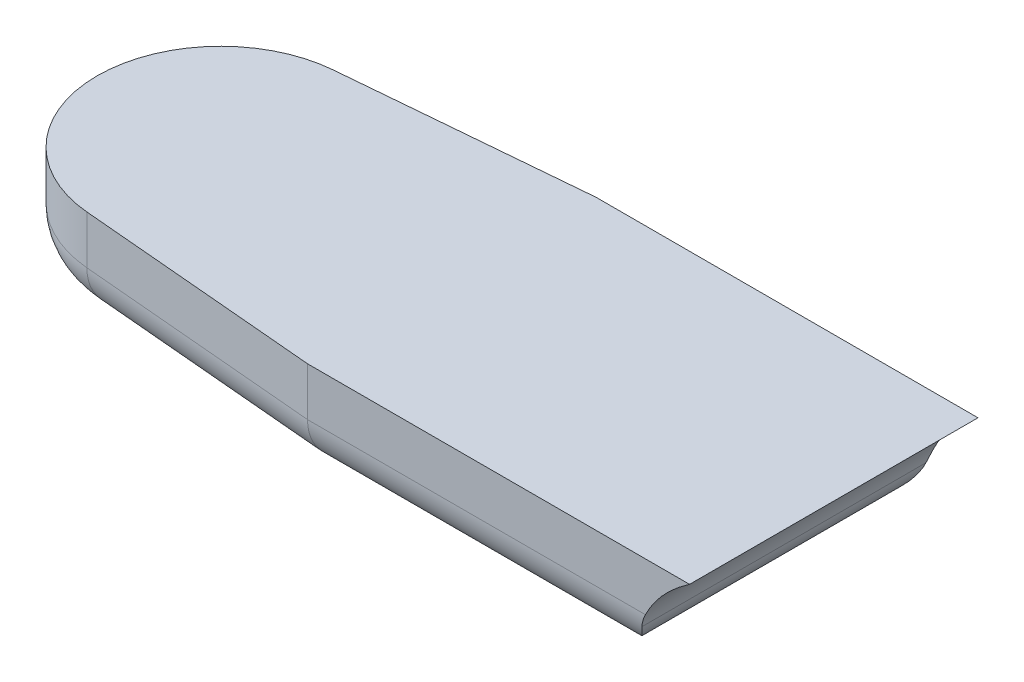
ISO-10303-21;
HEADER;
FILE_DESCRIPTION(('STEP AP214'),'2;1');
FILE_NAME('part.step','',(''),(''),'','','');
FILE_SCHEMA(('AUTOMOTIVE_DESIGN { 1 0 10303 214 1 1 1 1 }'));
ENDSEC;
DATA;
#1=APPLICATION_CONTEXT('core data for automotive mechanical design processes');
#2=APPLICATION_PROTOCOL_DEFINITION('international standard','automotive_design',2000,#1);
#3=PRODUCT_CONTEXT('',#1,'mechanical');
#4=PRODUCT('Part','Part','',(#3));
#5=PRODUCT_RELATED_PRODUCT_CATEGORY('part','',(#4));
#6=PRODUCT_DEFINITION_FORMATION('','',#4);
#7=PRODUCT_DEFINITION_CONTEXT('part definition',#1,'design');
#8=PRODUCT_DEFINITION('design','',#6,#7);
#9=PRODUCT_DEFINITION_SHAPE('','',#8);
#10=(LENGTH_UNIT() NAMED_UNIT(*) SI_UNIT(.MILLI.,.METRE.));
#11=(NAMED_UNIT(*) PLANE_ANGLE_UNIT() SI_UNIT($,.RADIAN.));
#12=(NAMED_UNIT(*) SI_UNIT($,.STERADIAN.) SOLID_ANGLE_UNIT());
#13=UNCERTAINTY_MEASURE_WITH_UNIT(LENGTH_MEASURE(1.E-05),#10,'distance_accuracy_value','');
#14=(GEOMETRIC_REPRESENTATION_CONTEXT(3) GLOBAL_UNCERTAINTY_ASSIGNED_CONTEXT((#13)) GLOBAL_UNIT_ASSIGNED_CONTEXT((#10,
#11,#12)) REPRESENTATION_CONTEXT('',''));
#15=CARTESIAN_POINT('',(0.,0.,0.));
#16=DIRECTION('',(0.,0.,1.));
#17=DIRECTION('',(1.,0.,0.));
#18=AXIS2_PLACEMENT_3D('',#15,#16,#17);
#19=CARTESIAN_POINT('',(32.8063610503625,-20.,0.));
#20=DIRECTION('',(0.,1.,0.));
#21=DIRECTION('',(0.,0.,1.));
#22=AXIS2_PLACEMENT_3D('',#19,#20,#21);
#23=CYLINDRICAL_SURFACE('',#22,25.5478591046329);
#24=DIRECTION('',(0.,1.,0.));
#25=VECTOR('',#24,1.);
#26=CARTESIAN_POINT('',(30.5797184144859,-20.,-25.4506417876303));
#27=LINE('',#26,#25);
#28=CARTESIAN_POINT('',(30.5797184144859,-10.,-25.4506417876303));
#29=VERTEX_POINT('',#28);
#30=CARTESIAN_POINT('',(30.5797184144859,0.,-25.4506417876303));
#31=VERTEX_POINT('',#30);
#32=EDGE_CURVE('E152',#29,#31,#27,.T.);
#33=ORIENTED_EDGE('',*,*,#32,.F.);
#34=CARTESIAN_POINT('',(32.8063610503625,-10.,0.));
#35=DIRECTION('',(0.,-1.,0.));
#36=DIRECTION('',(0.,0.,-1.));
#37=AXIS2_PLACEMENT_3D('',#34,#35,#36);
#38=CIRCLE('',#37,25.5478591046329);
#39=CARTESIAN_POINT('',(30.579718414486,-10.,25.4506417876303));
#40=VERTEX_POINT('',#39);
#41=EDGE_CURVE('E172',#29,#40,#38,.F.);
#42=ORIENTED_EDGE('',*,*,#41,.T.);
#43=DIRECTION('',(0.,1.,0.));
#44=VECTOR('',#43,1.);
#45=CARTESIAN_POINT('',(30.579718414486,-20.,25.4506417876303));
#46=LINE('',#45,#44);
#47=CARTESIAN_POINT('',(30.579718414486,0.,25.4506417876303));
#48=VERTEX_POINT('',#47);
#49=EDGE_CURVE('E141',#40,#48,#46,.T.);
#50=ORIENTED_EDGE('',*,*,#49,.T.);
#51=CARTESIAN_POINT('',(32.8063610503625,0.,0.));
#52=DIRECTION('',(0.,-1.,0.));
#53=DIRECTION('',(0.,0.,-1.));
#54=AXIS2_PLACEMENT_3D('',#51,#52,#53);
#55=CIRCLE('',#54,25.5478591046329);
#56=EDGE_CURVE('E125',#48,#31,#55,.T.);
#57=ORIENTED_EDGE('',*,*,#56,.T.);
#58=EDGE_LOOP('',(#33,#42,#50,#57));
#59=FACE_BOUND('',#58,.T.);
#60=ADVANCED_FACE('F39',(#59),#23,.T.);
#61=CARTESIAN_POINT('',(30.5797184144859,-20.,-25.4506417876303));
#62=DIRECTION('',(0.0871557427476479,0.,0.996194698091746));
#63=DIRECTION('',(0.996194698091746,0.,-0.0871557427476479));
#64=AXIS2_PLACEMENT_3D('',#61,#62,#63);
#65=PLANE('',#64);
#66=DIRECTION('',(0.,1.,0.));
#67=VECTOR('',#66,1.);
#68=CARTESIAN_POINT('',(80.579718414486,-20.,-29.8250749639259));
#69=LINE('',#68,#67);
#70=CARTESIAN_POINT('',(80.579718414486,-10.,-29.8250749639259));
#71=VERTEX_POINT('',#70);
#72=CARTESIAN_POINT('',(80.579718414486,0.,-29.8250749639259));
#73=VERTEX_POINT('',#72);
#74=EDGE_CURVE('E150',#71,#73,#69,.T.);
#75=ORIENTED_EDGE('',*,*,#74,.F.);
#76=DIRECTION('',(0.996194698091746,0.,-0.0871557427476479));
#77=VECTOR('',#76,1.);
#78=CARTESIAN_POINT('',(30.5797184144859,-10.,-25.4506417876303));
#79=LINE('',#78,#77);
#80=EDGE_CURVE('E170',#71,#29,#79,.F.);
#81=ORIENTED_EDGE('',*,*,#80,.T.);
#82=ORIENTED_EDGE('',*,*,#32,.T.);
#83=DIRECTION('',(0.996194698091746,0.,-0.0871557427476479));
#84=VECTOR('',#83,1.);
#85=CARTESIAN_POINT('',(30.5797184144859,0.,-25.4506417876303));
#86=LINE('',#85,#84);
#87=EDGE_CURVE('E143',#31,#73,#86,.T.);
#88=ORIENTED_EDGE('',*,*,#87,.T.);
#89=EDGE_LOOP('',(#75,#81,#82,#88));
#90=FACE_BOUND('',#89,.T.);
#91=ADVANCED_FACE('F207',(#90),#65,.F.);
#92=CARTESIAN_POINT('',(80.579718414486,-20.,-29.8250749639259));
#93=DIRECTION('',(0.,0.,1.));
#94=DIRECTION('',(1.,0.,0.));
#95=AXIS2_PLACEMENT_3D('',#92,#93,#94);
#96=PLANE('',#95);
#97=CARTESIAN_POINT('',(159.580719169521,0.,-29.8250749639259));
#98=CARTESIAN_POINT('',(148.122104630765,-7.82436088461839,-29.8250749639259));
#99=CARTESIAN_POINT('',(148.302724928041,-20.,-29.8250749639259));
#100=B_SPLINE_CURVE_WITH_KNOTS('',2,(#97,#98,#99),.UNSPECIFIED.,.F.,.F.,(3,3),(0.,1.),.UNSPECIFIED.);
#101=CARTESIAN_POINT('',(159.580719169521,0.,-29.8250749639259));
#102=VERTEX_POINT('',#101);
#103=CARTESIAN_POINT('',(150.459225920642,-10.,-29.8250749639259));
#104=VERTEX_POINT('',#103);
#105=EDGE_CURVE('E120',#102,#104,#100,.T.);
#106=ORIENTED_EDGE('',*,*,#105,.T.);
#107=DIRECTION('',(1.,0.,0.));
#108=VECTOR('',#107,1.);
#109=CARTESIAN_POINT('',(80.579718414486,-10.,-29.8250749639259));
#110=LINE('',#109,#108);
#111=EDGE_CURVE('E49',#104,#71,#110,.F.);
#112=ORIENTED_EDGE('',*,*,#111,.T.);
#113=ORIENTED_EDGE('',*,*,#74,.T.);
#114=DIRECTION('',(1.,0.,0.));
#115=VECTOR('',#114,1.);
#116=CARTESIAN_POINT('',(80.579718414486,0.,-29.8250749639259));
#117=LINE('',#116,#115);
#118=EDGE_CURVE('E139',#73,#102,#117,.T.);
#119=ORIENTED_EDGE('',*,*,#118,.T.);
#120=EDGE_LOOP('',(#106,#112,#113,#119));
#121=FACE_BOUND('',#120,.T.);
#122=ADVANCED_FACE('F211',(#121),#96,.F.);
#123=CARTESIAN_POINT('',(163.73029613279,-20.,29.8250749639259));
#124=DIRECTION('',(0.,0.,-1.));
#125=DIRECTION('',(-1.,0.,0.));
#126=AXIS2_PLACEMENT_3D('',#123,#124,#125);
#127=PLANE('',#126);
#128=DIRECTION('',(0.,1.,0.));
#129=VECTOR('',#128,1.);
#130=CARTESIAN_POINT('',(80.579718414486,-20.,29.8250749639259));
#131=LINE('',#130,#129);
#132=CARTESIAN_POINT('',(80.579718414486,-10.,29.8250749639259));
#133=VERTEX_POINT('',#132);
#134=CARTESIAN_POINT('',(80.579718414486,0.,29.8250749639259));
#135=VERTEX_POINT('',#134);
#136=EDGE_CURVE('E148',#133,#135,#131,.T.);
#137=ORIENTED_EDGE('',*,*,#136,.F.);
#138=DIRECTION('',(-1.,0.,0.));
#139=VECTOR('',#138,1.);
#140=CARTESIAN_POINT('',(148.302724928041,-10.,29.8250749639259));
#141=LINE('',#140,#139);
#142=CARTESIAN_POINT('',(150.459225920642,-10.,29.8250749639259));
#143=VERTEX_POINT('',#142);
#144=EDGE_CURVE('E11',#133,#143,#141,.F.);
#145=ORIENTED_EDGE('',*,*,#144,.T.);
#146=CARTESIAN_POINT('',(159.580719169521,0.,29.8250749639259));
#147=CARTESIAN_POINT('',(148.122104630765,-7.82436088461839,29.8250749639259));
#148=CARTESIAN_POINT('',(148.302724928041,-20.,29.8250749639259));
#149=B_SPLINE_CURVE_WITH_KNOTS('',2,(#146,#147,#148),.UNSPECIFIED.,.F.,.F.,(3,3),(0.,1.),.UNSPECIFIED.);
#150=CARTESIAN_POINT('',(159.580719169521,0.,29.8250749639259));
#151=VERTEX_POINT('',#150);
#152=EDGE_CURVE('E118',#151,#143,#149,.T.);
#153=ORIENTED_EDGE('',*,*,#152,.F.);
#154=DIRECTION('',(-1.,0.,0.));
#155=VECTOR('',#154,1.);
#156=CARTESIAN_POINT('',(163.73029613279,0.,29.8250749639259));
#157=LINE('',#156,#155);
#158=EDGE_CURVE('E131',#151,#135,#157,.T.);
#159=ORIENTED_EDGE('',*,*,#158,.T.);
#160=EDGE_LOOP('',(#137,#145,#153,#159));
#161=FACE_BOUND('',#160,.T.);
#162=ADVANCED_FACE('F130',(#161),#127,.F.);
#163=CARTESIAN_POINT('',(80.579718414486,-20.,29.8250749639259));
#164=DIRECTION('',(0.0871557427476475,0.,-0.996194698091746));
#165=DIRECTION('',(-0.996194698091746,0.,-0.0871557427476475));
#166=AXIS2_PLACEMENT_3D('',#163,#164,#165);
#167=PLANE('',#166);
#168=ORIENTED_EDGE('',*,*,#49,.F.);
#169=DIRECTION('',(-0.996194698091746,0.,-0.0871557427476475));
#170=VECTOR('',#169,1.);
#171=CARTESIAN_POINT('',(80.5797184144859,-10.,29.8250749639259));
#172=LINE('',#171,#170);
#173=EDGE_CURVE('E167',#40,#133,#172,.F.);
#174=ORIENTED_EDGE('',*,*,#173,.T.);
#175=ORIENTED_EDGE('',*,*,#136,.T.);
#176=DIRECTION('',(-0.996194698091746,0.,-0.0871557427476475));
#177=VECTOR('',#176,1.);
#178=CARTESIAN_POINT('',(80.579718414486,0.,29.8250749639259));
#179=LINE('',#178,#177);
#180=EDGE_CURVE('E138',#135,#48,#179,.T.);
#181=ORIENTED_EDGE('',*,*,#180,.T.);
#182=EDGE_LOOP('',(#168,#174,#175,#181));
#183=FACE_BOUND('',#182,.T.);
#184=ADVANCED_FACE('F254',(#183),#167,.F.);
#185=CARTESIAN_POINT('',(32.8063610503625,-20.,0.));
#186=DIRECTION('',(0.,-1.,0.));
#187=DIRECTION('',(0.,0.,-1.));
#188=AXIS2_PLACEMENT_3D('',#185,#186,#187);
#189=PLANE('',#188);
#190=CARTESIAN_POINT('',(32.8063610503625,-20.,0.));
#191=DIRECTION('',(0.,-1.,0.));
#192=DIRECTION('',(0.,0.,-1.));
#193=AXIS2_PLACEMENT_3D('',#190,#191,#192);
#194=CIRCLE('',#193,15.5478591046329);
#195=CARTESIAN_POINT('',(31.4512758419624,-20.,15.4886948067128));
#196=VERTEX_POINT('',#195);
#197=CARTESIAN_POINT('',(31.4512758419624,-20.,-15.4886948067128));
#198=VERTEX_POINT('',#197);
#199=EDGE_CURVE('E163',#196,#198,#194,.T.);
#200=ORIENTED_EDGE('',*,*,#199,.T.);
#201=DIRECTION('',(0.996194698091746,0.,-0.0871557427476479));
#202=VECTOR('',#201,1.);
#203=CARTESIAN_POINT('',(81.4512758419624,-20.,-19.8631279830085));
#204=LINE('',#203,#202);
#205=CARTESIAN_POINT('',(81.016327843571,-20.,-19.8250749639259));
#206=VERTEX_POINT('',#205);
#207=EDGE_CURVE('E165',#198,#206,#204,.T.);
#208=ORIENTED_EDGE('',*,*,#207,.T.);
#209=DIRECTION('',(1.,0.,0.));
#210=VECTOR('',#209,1.);
#211=CARTESIAN_POINT('',(148.302724928041,-20.,-19.8250749639259));
#212=LINE('',#211,#210);
#213=CARTESIAN_POINT('',(139.728885344631,-20.,-19.8250749639259));
#214=VERTEX_POINT('',#213);
#215=EDGE_CURVE('E161',#206,#214,#212,.T.);
#216=ORIENTED_EDGE('',*,*,#215,.T.);
#217=DIRECTION('',(0.,0.,-1.));
#218=VECTOR('',#217,1.);
#219=CARTESIAN_POINT('',(139.728885344631,-20.,29.8250749639259));
#220=LINE('',#219,#218);
#221=CARTESIAN_POINT('',(139.728885344631,-20.,19.8250749639259));
#222=VERTEX_POINT('',#221);
#223=EDGE_CURVE('E156',#214,#222,#220,.F.);
#224=ORIENTED_EDGE('',*,*,#223,.T.);
#225=DIRECTION('',(-1.,0.,0.));
#226=VECTOR('',#225,1.);
#227=CARTESIAN_POINT('',(80.579718414486,-20.,19.8250749639259));
#228=LINE('',#227,#226);
#229=CARTESIAN_POINT('',(81.0163278435711,-20.,19.8250749639259));
#230=VERTEX_POINT('',#229);
#231=EDGE_CURVE('E154',#222,#230,#228,.T.);
#232=ORIENTED_EDGE('',*,*,#231,.T.);
#233=DIRECTION('',(-0.996194698091746,0.,-0.0871557427476475));
#234=VECTOR('',#233,1.);
#235=CARTESIAN_POINT('',(31.4512758419624,-20.,15.4886948067128));
#236=LINE('',#235,#234);
#237=EDGE_CURVE('E158',#230,#196,#236,.T.);
#238=ORIENTED_EDGE('',*,*,#237,.T.);
#239=EDGE_LOOP('',(#200,#208,#216,#224,#232,#238));
#240=FACE_BOUND('',#239,.T.);
#241=ADVANCED_FACE('F190',(#240),#189,.T.);
#242=CARTESIAN_POINT('',(32.8063610503625,0.,0.));
#243=DIRECTION('',(0.,-1.,0.));
#244=DIRECTION('',(0.,0.,-1.));
#245=AXIS2_PLACEMENT_3D('',#242,#243,#244);
#246=PLANE('',#245);
#247=ORIENTED_EDGE('',*,*,#158,.F.);
#248=DIRECTION('',(0.,0.,1.));
#249=VECTOR('',#248,1.);
#250=CARTESIAN_POINT('',(159.580719169521,0.,-29.8250749639259));
#251=LINE('',#250,#249);
#252=EDGE_CURVE('E115',#102,#151,#251,.T.);
#253=ORIENTED_EDGE('',*,*,#252,.F.);
#254=ORIENTED_EDGE('',*,*,#118,.F.);
#255=ORIENTED_EDGE('',*,*,#87,.F.);
#256=ORIENTED_EDGE('',*,*,#56,.F.);
#257=ORIENTED_EDGE('',*,*,#180,.F.);
#258=EDGE_LOOP('',(#247,#253,#254,#255,#256,#257));
#259=FACE_BOUND('',#258,.T.);
#260=ADVANCED_FACE('F135',(#259),#246,.F.);
#261=DIRECTION('',(0.,0.,1.));
#262=VECTOR('',#261,1.);
#263=SURFACE_OF_LINEAR_EXTRUSION('',#100,#262);
#264=DIRECTION('',(0.,0.,1.));
#265=VECTOR('',#264,1.);
#266=CARTESIAN_POINT('',(149.277717297206,-12.9698162134191,29.8250749639259));
#267=LINE('',#266,#265);
#268=CARTESIAN_POINT('',(149.277717297206,-12.9698162134191,29.3739069165007));
#269=VERTEX_POINT('',#268);
#270=CARTESIAN_POINT('',(149.277717297206,-12.9698162134191,-29.3739069165007));
#271=VERTEX_POINT('',#270);
#272=EDGE_CURVE('E57',#269,#271,#267,.F.);
#273=ORIENTED_EDGE('',*,*,#272,.T.);
#274=CARTESIAN_POINT('',(149.277717297206,-12.9698162134191,-29.3739069165007));
#275=CARTESIAN_POINT('',(149.308686635789,-12.8702359889375,-29.4048789922274));
#276=CARTESIAN_POINT('',(149.340551662712,-12.770425691505,-29.4342117292264));
#277=CARTESIAN_POINT('',(149.405925347225,-12.5709240410192,-29.4894947800758));
#278=CARTESIAN_POINT('',(149.439426206298,-12.4712340771194,-29.5154593268656));
#279=CARTESIAN_POINT('',(149.508084377153,-12.2719991284124,-29.5640945767829));
#280=CARTESIAN_POINT('',(149.543236022254,-12.172454706568,-29.5867755927443));
#281=CARTESIAN_POINT('',(149.615206495322,-11.9735335305849,-29.6289252239636));
#282=CARTESIAN_POINT('',(149.652021684415,-11.8741568609661,-29.6484004556381));
#283=CARTESIAN_POINT('',(149.727330401497,-11.6755918057199,-29.6842108125354));
#284=CARTESIAN_POINT('',(149.765822203624,-11.5764033312529,-29.7005490773389));
#285=CARTESIAN_POINT('',(149.844485130291,-11.3782583428374,-29.7301462017444));
#286=CARTESIAN_POINT('',(149.88465589777,-11.2793017842481,-29.7434057122037));
#287=CARTESIAN_POINT('',(149.966700351731,-11.0816038141927,-29.7669084840577));
#288=CARTESIAN_POINT('',(150.008575926408,-10.9828627763454,-29.7771482914454));
#289=CARTESIAN_POINT('',(150.094043752476,-10.7856054898448,-29.794661206804));
#290=CARTESIAN_POINT('',(150.137639538474,-10.6870901967605,-29.8019278158543));
#291=CARTESIAN_POINT('',(150.226561977699,-10.4902938573023,-29.8135362062643));
#292=CARTESIAN_POINT('',(150.271893680729,-10.3920145440778,-29.8178686407651));
#293=CARTESIAN_POINT('',(150.364301336711,-10.1956969295301,-29.8236443074436));
#294=CARTESIAN_POINT('',(150.411383721438,-10.0976613008814,-29.8250755306654));
#295=CARTESIAN_POINT('',(150.459225920642,-10.,-29.8250749639259));
#296=B_SPLINE_CURVE_WITH_KNOTS('',3,(#274,#275,#276,#277,#278,#279,#280,#281,#282,#283,#284,
#285,#286,#287,#288,#289,#290,#291,#292,#293,#294,#295),.UNSPECIFIED.,.F.,.F.,(4,2,2,2,2,2,2,2,
2,2,4),(0.,0.326342768659835,0.651258175541548,0.975129862405119,1.2983244941365,
1.62119395627919,1.94399510063436,2.26716405297275,2.59103567333557,2.91593419935712,
3.24217485093652),.UNSPECIFIED.);
#297=EDGE_CURVE('E214',#271,#104,#296,.T.);
#298=ORIENTED_EDGE('',*,*,#297,.T.);
#299=ORIENTED_EDGE('',*,*,#105,.F.);
#300=ORIENTED_EDGE('',*,*,#252,.T.);
#301=ORIENTED_EDGE('',*,*,#152,.T.);
#302=CARTESIAN_POINT('',(150.459225920642,-10.,29.8250749639259));
#303=CARTESIAN_POINT('',(150.411383721438,-10.0976613008814,29.8250755306654));
#304=CARTESIAN_POINT('',(150.364301336711,-10.1956969295301,29.8236443074436));
#305=CARTESIAN_POINT('',(150.271893680729,-10.3920145440778,29.8178686407651));
#306=CARTESIAN_POINT('',(150.226561977699,-10.4902938573023,29.8135362062643));
#307=CARTESIAN_POINT('',(150.137639538474,-10.6870901967605,29.8019278158543));
#308=CARTESIAN_POINT('',(150.094043752476,-10.7856054898448,29.794661206804));
#309=CARTESIAN_POINT('',(150.008575926408,-10.9828627763454,29.7771482914454));
#310=CARTESIAN_POINT('',(149.966700351731,-11.0816038141927,29.7669084840577));
#311=CARTESIAN_POINT('',(149.88465589777,-11.2793017842481,29.7434057122037));
#312=CARTESIAN_POINT('',(149.844485130291,-11.3782583428374,29.7301462017444));
#313=CARTESIAN_POINT('',(149.765822203624,-11.5764033312529,29.7005490773389));
#314=CARTESIAN_POINT('',(149.727330401497,-11.6755918057199,29.6842108125354));
#315=CARTESIAN_POINT('',(149.652021684415,-11.8741568609661,29.6484004556381));
#316=CARTESIAN_POINT('',(149.615206495322,-11.9735335305849,29.6289252239636));
#317=CARTESIAN_POINT('',(149.543236022254,-12.172454706568,29.5867755927442));
#318=CARTESIAN_POINT('',(149.508084377153,-12.2719991284124,29.5640945767829));
#319=CARTESIAN_POINT('',(149.439426206298,-12.4712340771194,29.5154593268656));
#320=CARTESIAN_POINT('',(149.405925347225,-12.5709240410193,29.4894947800757));
#321=CARTESIAN_POINT('',(149.340551662712,-12.770425691505,29.4342117292264));
#322=CARTESIAN_POINT('',(149.308686635789,-12.8702359889375,29.4048789922274));
#323=CARTESIAN_POINT('',(149.277717297206,-12.9698162134191,29.3739069165007));
#324=B_SPLINE_CURVE_WITH_KNOTS('',3,(#302,#303,#304,#305,#306,#307,#308,#309,#310,#311,#312,
#313,#314,#315,#316,#317,#318,#319,#320,#321,#322,#323),.UNSPECIFIED.,.F.,.F.,(4,2,2,2,2,2,2,2,
2,2,4),(0.,0.3262406515794,0.651139177600948,0.975010797963782,1.29817975030217,
1.62098089465733,1.94385035680003,2.26704498853141,2.59091667539499,2.91583208227669,
3.24217485093653),.UNSPECIFIED.);
#325=EDGE_CURVE('E62',#143,#269,#324,.T.);
#326=ORIENTED_EDGE('',*,*,#325,.T.);
#327=EDGE_LOOP('',(#273,#298,#299,#300,#301,#326));
#328=FACE_BOUND('',#327,.T.);
#329=ADVANCED_FACE('F117',(#328),#263,.F.);
#330=CARTESIAN_POINT('',(32.8063610503625,-10.,-19.8250749639259));
#331=DIRECTION('',(-1.,0.,0.));
#332=DIRECTION('',(0.,0.,1.));
#333=AXIS2_PLACEMENT_3D('',#330,#331,#332);
#334=CYLINDRICAL_SURFACE('',#333,10.);
#335=ORIENTED_EDGE('',*,*,#111,.F.);
#336=ORIENTED_EDGE('',*,*,#297,.F.);
#337=CARTESIAN_POINT('',(139.728885344631,-10.,-19.8250749639259));
#338=DIRECTION('',(-0.707106781186547,0.,-0.707106781186547));
#339=DIRECTION('',(-0.707106781186547,0.,0.707106781186547));
#340=AXIS2_PLACEMENT_3D('',#337,#338,#339);
#341=ELLIPSE('',#340,14.1421356237309,10.);
#342=EDGE_CURVE('E44',#214,#271,#341,.F.);
#343=ORIENTED_EDGE('',*,*,#342,.F.);
#344=ORIENTED_EDGE('',*,*,#215,.F.);
#345=CARTESIAN_POINT('',(81.016327843571,-10.,-19.8250749639259));
#346=DIRECTION('',(-0.999048221581858,0.,0.0436193873653309));
#347=DIRECTION('',(-0.0436193873653308,0.,-0.999048221581858));
#348=AXIS2_PLACEMENT_3D('',#345,#346,#347);
#349=ELLIPSE('',#348,10.0095268516332,10.);
#350=EDGE_CURVE('E230',#71,#206,#349,.T.);
#351=ORIENTED_EDGE('',*,*,#350,.F.);
#352=EDGE_LOOP('',(#335,#336,#343,#344,#351));
#353=FACE_BOUND('',#352,.T.);
#354=ADVANCED_FACE('F41',(#353),#334,.T.);
#355=CARTESIAN_POINT('',(139.728885344631,-10.,0.));
#356=DIRECTION('',(0.,0.,1.));
#357=DIRECTION('',(1.,0.,0.));
#358=AXIS2_PLACEMENT_3D('',#355,#356,#357);
#359=CYLINDRICAL_SURFACE('',#358,10.);
#360=ORIENTED_EDGE('',*,*,#342,.T.);
#361=ORIENTED_EDGE('',*,*,#272,.F.);
#362=CARTESIAN_POINT('',(139.728885344631,-10.,19.8250749639259));
#363=DIRECTION('',(0.707106781186547,0.,-0.707106781186548));
#364=DIRECTION('',(0.707106781186548,0.,0.707106781186547));
#365=AXIS2_PLACEMENT_3D('',#362,#363,#364);
#366=ELLIPSE('',#365,14.1421356237309,10.);
#367=EDGE_CURVE('E228',#222,#269,#366,.F.);
#368=ORIENTED_EDGE('',*,*,#367,.F.);
#369=ORIENTED_EDGE('',*,*,#223,.F.);
#370=EDGE_LOOP('',(#360,#361,#368,#369));
#371=FACE_BOUND('',#370,.T.);
#372=ADVANCED_FACE('F239',(#371),#359,.T.);
#373=CARTESIAN_POINT('',(31.4512758419624,-10.,-15.4886948067128));
#374=DIRECTION('',(-0.996194698091746,0.,0.0871557427476479));
#375=DIRECTION('',(0.0871557427476479,0.,0.996194698091746));
#376=AXIS2_PLACEMENT_3D('',#373,#374,#375);
#377=CYLINDRICAL_SURFACE('',#376,10.);
#378=ORIENTED_EDGE('',*,*,#350,.T.);
#379=ORIENTED_EDGE('',*,*,#207,.F.);
#380=CARTESIAN_POINT('',(31.4512758419624,-10.,-15.4886948067128));
#381=DIRECTION('',(-0.996194698091746,0.,0.087155742747648));
#382=DIRECTION('',(0.087155742747648,0.,0.996194698091746));
#383=AXIS2_PLACEMENT_3D('',#380,#381,#382);
#384=CIRCLE('',#383,10.);
#385=EDGE_CURVE('E225',#29,#198,#384,.T.);
#386=ORIENTED_EDGE('',*,*,#385,.F.);
#387=ORIENTED_EDGE('',*,*,#80,.F.);
#388=EDGE_LOOP('',(#378,#379,#386,#387));
#389=FACE_BOUND('',#388,.T.);
#390=ADVANCED_FACE('F245',(#389),#377,.T.);
#391=CARTESIAN_POINT('',(32.8063610503625,-10.,19.8250749639259));
#392=DIRECTION('',(1.,0.,0.));
#393=DIRECTION('',(0.,0.,-1.));
#394=AXIS2_PLACEMENT_3D('',#391,#392,#393);
#395=CYLINDRICAL_SURFACE('',#394,10.);
#396=ORIENTED_EDGE('',*,*,#325,.F.);
#397=ORIENTED_EDGE('',*,*,#144,.F.);
#398=CARTESIAN_POINT('',(81.0163278435711,-10.,19.8250749639259));
#399=DIRECTION('',(0.999048221581858,0.,0.0436193873653306));
#400=DIRECTION('',(0.0436193873653309,0.,-0.999048221581858));
#401=AXIS2_PLACEMENT_3D('',#398,#399,#400);
#402=ELLIPSE('',#401,10.0095268516332,10.);
#403=EDGE_CURVE('E223',#230,#133,#402,.F.);
#404=ORIENTED_EDGE('',*,*,#403,.F.);
#405=ORIENTED_EDGE('',*,*,#231,.F.);
#406=ORIENTED_EDGE('',*,*,#367,.T.);
#407=EDGE_LOOP('',(#396,#397,#404,#405,#406));
#408=FACE_BOUND('',#407,.T.);
#409=ADVANCED_FACE('F182',(#408),#395,.T.);
#410=CARTESIAN_POINT('',(32.8063610503625,-10.,0.));
#411=DIRECTION('',(0.,-1.,0.));
#412=DIRECTION('',(0.,0.,-1.));
#413=AXIS2_PLACEMENT_3D('',#410,#411,#412);
#414=TOROIDAL_SURFACE('',#413,15.5478591046329,10.);
#415=ORIENTED_EDGE('',*,*,#385,.T.);
#416=ORIENTED_EDGE('',*,*,#199,.F.);
#417=CARTESIAN_POINT('',(31.4512758419624,-10.,15.4886948067128));
#418=DIRECTION('',(0.996194698091747,0.,0.0871557427476473));
#419=DIRECTION('',(0.0871557427476473,0.,-0.996194698091747));
#420=AXIS2_PLACEMENT_3D('',#417,#418,#419);
#421=CIRCLE('',#420,10.);
#422=EDGE_CURVE('E221',#40,#196,#421,.T.);
#423=ORIENTED_EDGE('',*,*,#422,.F.);
#424=ORIENTED_EDGE('',*,*,#41,.F.);
#425=EDGE_LOOP('',(#415,#416,#423,#424));
#426=FACE_BOUND('',#425,.T.);
#427=ADVANCED_FACE('F248',(#426),#414,.T.);
#428=CARTESIAN_POINT('',(31.4512758419624,-10.,15.4886948067128));
#429=DIRECTION('',(0.996194698091746,0.,0.0871557427476475));
#430=DIRECTION('',(0.0871557427476475,0.,-0.996194698091746));
#431=AXIS2_PLACEMENT_3D('',#428,#429,#430);
#432=CYLINDRICAL_SURFACE('',#431,10.);
#433=ORIENTED_EDGE('',*,*,#403,.T.);
#434=ORIENTED_EDGE('',*,*,#173,.F.);
#435=ORIENTED_EDGE('',*,*,#422,.T.);
#436=ORIENTED_EDGE('',*,*,#237,.F.);
#437=EDGE_LOOP('',(#433,#434,#435,#436));
#438=FACE_BOUND('',#437,.T.);
#439=ADVANCED_FACE('F256',(#438),#432,.T.);
#440=CLOSED_SHELL('',(#60,#91,#122,#162,#184,#241,#260,#329,#354,#372,#390,#409,#427,#439));
#441=MANIFOLD_SOLID_BREP('B2',#440);
#442=ADVANCED_BREP_SHAPE_REPRESENTATION('',(#18,#441),#14);
#443=SHAPE_DEFINITION_REPRESENTATION(#9,#442);
ENDSEC;
END-ISO-10303-21;
